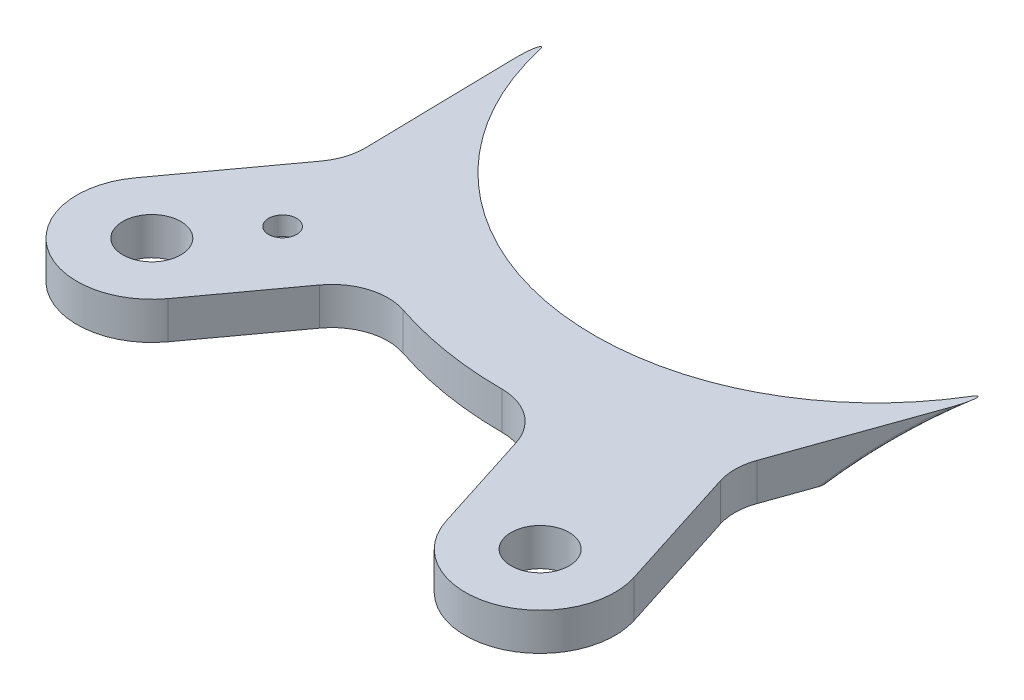
ISO-10303-21;
HEADER;
FILE_DESCRIPTION(('STEP AP214'),'2;1');
FILE_NAME('part.step','',(''),(''),'','','');
FILE_SCHEMA(('AUTOMOTIVE_DESIGN { 1 0 10303 214 1 1 1 1 }'));
ENDSEC;
DATA;
#1=APPLICATION_CONTEXT('core data for automotive mechanical design processes');
#2=APPLICATION_PROTOCOL_DEFINITION('international standard','automotive_design',2000,#1);
#3=PRODUCT_CONTEXT('',#1,'mechanical');
#4=PRODUCT('Part','Part','',(#3));
#5=PRODUCT_RELATED_PRODUCT_CATEGORY('part','',(#4));
#6=PRODUCT_DEFINITION_FORMATION('','',#4);
#7=PRODUCT_DEFINITION_CONTEXT('part definition',#1,'design');
#8=PRODUCT_DEFINITION('design','',#6,#7);
#9=PRODUCT_DEFINITION_SHAPE('','',#8);
#10=(LENGTH_UNIT() NAMED_UNIT(*) SI_UNIT(.MILLI.,.METRE.));
#11=(NAMED_UNIT(*) PLANE_ANGLE_UNIT() SI_UNIT($,.RADIAN.));
#12=(NAMED_UNIT(*) SI_UNIT($,.STERADIAN.) SOLID_ANGLE_UNIT());
#13=UNCERTAINTY_MEASURE_WITH_UNIT(LENGTH_MEASURE(1.E-05),#10,'distance_accuracy_value','');
#14=(GEOMETRIC_REPRESENTATION_CONTEXT(3) GLOBAL_UNCERTAINTY_ASSIGNED_CONTEXT((#13)) GLOBAL_UNIT_ASSIGNED_CONTEXT((#10,
#11,#12)) REPRESENTATION_CONTEXT('',''));
#15=CARTESIAN_POINT('',(0.,0.,0.));
#16=DIRECTION('',(0.,0.,1.));
#17=DIRECTION('',(1.,0.,0.));
#18=AXIS2_PLACEMENT_3D('',#15,#16,#17);
#19=CARTESIAN_POINT('',(-11.920981795953,2.,-8.70254765488495));
#20=DIRECTION('',(0.807679539292025,0.,0.589621710768033));
#21=DIRECTION('',(0.589621710768033,0.,-0.807679539292026));
#22=AXIS2_PLACEMENT_3D('',#19,#20,#21);
#23=PLANE('',#22);
#24=DIRECTION('',(-0.589621710768033,0.,0.807679539292026));
#25=VECTOR('',#24,1.);
#26=CARTESIAN_POINT('',(-11.920981795953,2.,-8.70254765488495));
#27=LINE('',#26,#25);
#28=CARTESIAN_POINT('',(-10.0241295132366,2.,-11.3009064836563));
#29=VERTEX_POINT('',#28);
#30=CARTESIAN_POINT('',(-14.2059725719786,2.,-5.57250636983299));
#31=VERTEX_POINT('',#30);
#32=EDGE_CURVE('E165',#29,#31,#27,.T.);
#33=ORIENTED_EDGE('',*,*,#32,.F.);
#34=DIRECTION('',(0.,-1.,0.));
#35=VECTOR('',#34,1.);
#36=CARTESIAN_POINT('',(-10.0241295132366,2.,-11.3009064836563));
#37=LINE('',#36,#35);
#38=CARTESIAN_POINT('',(-10.0241295132366,0.,-11.3009064836563));
#39=VERTEX_POINT('',#38);
#40=EDGE_CURVE('E197',#29,#39,#37,.T.);
#41=ORIENTED_EDGE('',*,*,#40,.T.);
#42=DIRECTION('',(-0.589621710768033,0.,0.807679539292026));
#43=VECTOR('',#42,1.);
#44=CARTESIAN_POINT('',(-11.920981795953,0.,-8.70254765488495));
#45=LINE('',#44,#43);
#46=CARTESIAN_POINT('',(-14.2059725719786,0.,-5.57250636983299));
#47=VERTEX_POINT('',#46);
#48=EDGE_CURVE('E194',#39,#47,#45,.T.);
#49=ORIENTED_EDGE('',*,*,#48,.T.);
#50=DIRECTION('',(0.,-1.,0.));
#51=VECTOR('',#50,1.);
#52=CARTESIAN_POINT('',(-14.2059725719786,2.,-5.57250636983299));
#53=LINE('',#52,#51);
#54=EDGE_CURVE('E186',#31,#47,#53,.T.);
#55=ORIENTED_EDGE('',*,*,#54,.F.);
#56=EDGE_LOOP('',(#33,#41,#49,#55));
#57=FACE_BOUND('',#56,.T.);
#58=ADVANCED_FACE('F47',(#57),#23,.F.);
#59=CARTESIAN_POINT('',(-10.9752544148105,2.,-3.21401952676085));
#60=DIRECTION('',(0.,-1.,0.));
#61=DIRECTION('',(0.,0.,-1.));
#62=AXIS2_PLACEMENT_3D('',#59,#60,#61);
#63=CYLINDRICAL_SURFACE('',#62,4.00000000000001);
#64=CARTESIAN_POINT('',(-10.9752544148105,0.,-3.21401952676085));
#65=DIRECTION('',(0.,1.,0.));
#66=DIRECTION('',(0.,0.,1.));
#67=AXIS2_PLACEMENT_3D('',#64,#65,#66);
#68=CIRCLE('',#67,4.00000000000001);
#69=CARTESIAN_POINT('',(-7.74453625764238,0.,-0.855532683688701));
#70=VERTEX_POINT('',#69);
#71=EDGE_CURVE('E440',#47,#70,#68,.T.);
#72=ORIENTED_EDGE('',*,*,#71,.T.);
#73=DIRECTION('',(0.,-1.,0.));
#74=VECTOR('',#73,1.);
#75=CARTESIAN_POINT('',(-7.74453625764238,2.,-0.855532683688701));
#76=LINE('',#75,#74);
#77=CARTESIAN_POINT('',(-7.74453625764238,2.,-0.855532683688701));
#78=VERTEX_POINT('',#77);
#79=EDGE_CURVE('E188',#78,#70,#76,.T.);
#80=ORIENTED_EDGE('',*,*,#79,.F.);
#81=CARTESIAN_POINT('',(-10.9752544148105,2.,-3.21401952676085));
#82=DIRECTION('',(0.,1.,0.));
#83=DIRECTION('',(0.,0.,1.));
#84=AXIS2_PLACEMENT_3D('',#81,#82,#83);
#85=CIRCLE('',#84,4.00000000000001);
#86=EDGE_CURVE('E171',#31,#78,#85,.T.);
#87=ORIENTED_EDGE('',*,*,#86,.F.);
#88=ORIENTED_EDGE('',*,*,#54,.T.);
#89=EDGE_LOOP('',(#72,#80,#87,#88));
#90=FACE_BOUND('',#89,.T.);
#91=ADVANCED_FACE('F185',(#90),#63,.T.);
#92=CARTESIAN_POINT('',(-5.45954548161673,2.,-3.98557396874065));
#93=DIRECTION('',(-0.807679539292025,0.,-0.589621710768033));
#94=DIRECTION('',(-0.589621710768033,0.,0.807679539292025));
#95=AXIS2_PLACEMENT_3D('',#92,#93,#94);
#96=PLANE('',#95);
#97=DIRECTION('',(0.589621710768033,0.,-0.807679539292025));
#98=VECTOR('',#97,1.);
#99=CARTESIAN_POINT('',(-5.45954548161673,0.,-3.98557396874065));
#100=LINE('',#99,#98);
#101=CARTESIAN_POINT('',(-4.32997932465112,0.,-5.53288380587244));
#102=VERTEX_POINT('',#101);
#103=EDGE_CURVE('E405',#70,#102,#100,.T.);
#104=ORIENTED_EDGE('',*,*,#103,.T.);
#105=DIRECTION('',(0.,1.,0.));
#106=VECTOR('',#105,1.);
#107=CARTESIAN_POINT('',(-4.32997932465112,2.,-5.53288380587244));
#108=LINE('',#107,#106);
#109=CARTESIAN_POINT('',(-4.32997932465112,2.,-5.53288380587244));
#110=VERTEX_POINT('',#109);
#111=EDGE_CURVE('E227',#102,#110,#108,.T.);
#112=ORIENTED_EDGE('',*,*,#111,.T.);
#113=DIRECTION('',(0.589621710768033,0.,-0.807679539292025));
#114=VECTOR('',#113,1.);
#115=CARTESIAN_POINT('',(-5.45954548161673,2.,-3.98557396874065));
#116=LINE('',#115,#114);
#117=EDGE_CURVE('E191',#78,#110,#116,.T.);
#118=ORIENTED_EDGE('',*,*,#117,.F.);
#119=ORIENTED_EDGE('',*,*,#79,.T.);
#120=EDGE_LOOP('',(#104,#112,#118,#119));
#121=FACE_BOUND('',#120,.T.);
#122=ADVANCED_FACE('F328',(#121),#96,.F.);
#123=CARTESIAN_POINT('',(5.35726697347827,2.,-25.5867427651695));
#124=DIRECTION('',(0.,-1.,0.));
#125=DIRECTION('',(0.,0.,-1.));
#126=AXIS2_PLACEMENT_3D('',#123,#124,#125);
#127=CYLINDRICAL_SURFACE('',#126,20.);
#128=CARTESIAN_POINT('',(5.35726697347827,0.,-25.5867427651695));
#129=DIRECTION('',(0.,1.,0.));
#130=DIRECTION('',(0.,0.,1.));
#131=AXIS2_PLACEMENT_3D('',#128,#129,#130);
#132=CIRCLE('',#131,20.);
#133=CARTESIAN_POINT('',(-0.959435357176782,0.,-6.61046094638588));
#134=VERTEX_POINT('',#133);
#135=CARTESIAN_POINT('',(5.35473098050555,0.,-5.58674292595099));
#136=VERTEX_POINT('',#135);
#137=EDGE_CURVE('E401',#134,#136,#132,.T.);
#138=ORIENTED_EDGE('',*,*,#137,.T.);
#139=DIRECTION('',(0.,-1.,0.));
#140=VECTOR('',#139,1.);
#141=CARTESIAN_POINT('',(5.35473098050555,2.,-5.58674292595099));
#142=LINE('',#141,#140);
#143=CARTESIAN_POINT('',(5.35473098050555,2.,-5.58674292595099));
#144=VERTEX_POINT('',#143);
#145=EDGE_CURVE('E224',#136,#144,#142,.F.);
#146=ORIENTED_EDGE('',*,*,#145,.T.);
#147=CARTESIAN_POINT('',(5.35726697347827,2.,-25.5867427651695));
#148=DIRECTION('',(0.,1.,0.));
#149=DIRECTION('',(0.,0.,1.));
#150=AXIS2_PLACEMENT_3D('',#147,#148,#149);
#151=CIRCLE('',#150,20.);
#152=CARTESIAN_POINT('',(-0.959435357176782,2.,-6.61046094638588));
#153=VERTEX_POINT('',#152);
#154=EDGE_CURVE('E451',#153,#144,#151,.T.);
#155=ORIENTED_EDGE('',*,*,#154,.F.);
#156=DIRECTION('',(0.,-1.,0.));
#157=VECTOR('',#156,1.);
#158=CARTESIAN_POINT('',(-0.959435357176783,2.,-6.61046094638587));
#159=LINE('',#158,#157);
#160=EDGE_CURVE('E220',#153,#134,#159,.T.);
#161=ORIENTED_EDGE('',*,*,#160,.T.);
#162=EDGE_LOOP('',(#138,#146,#155,#161));
#163=FACE_BOUND('',#162,.T.);
#164=ADVANCED_FACE('F331',(#163),#127,.T.);
#165=CARTESIAN_POINT('',(8.46623721619208,2.,-2.70382058589086));
#166=DIRECTION('',(-0.952599553113903,0.,0.304227039244038));
#167=DIRECTION('',(0.304227039244038,0.,0.952599553113903));
#168=AXIS2_PLACEMENT_3D('',#165,#166,#167);
#169=PLANE('',#168);
#170=DIRECTION('',(-0.304227039244038,0.,-0.952599553113902));
#171=VECTOR('',#170,1.);
#172=CARTESIAN_POINT('',(8.46623721619208,2.,-2.70382058589086));
#173=LINE('',#172,#171);
#174=CARTESIAN_POINT('',(9.97395774809266,2.,2.01717301309372));
#175=VERTEX_POINT('',#174);
#176=CARTESIAN_POINT('',(8.21214924090135,2.,-3.49942406780033));
#177=VERTEX_POINT('',#176);
#178=EDGE_CURVE('E456',#175,#177,#173,.T.);
#179=ORIENTED_EDGE('',*,*,#178,.T.);
#180=DIRECTION('',(0.,-1.,0.));
#181=VECTOR('',#180,1.);
#182=CARTESIAN_POINT('',(8.21214924090135,2.,-3.49942406780033));
#183=LINE('',#182,#181);
#184=CARTESIAN_POINT('',(8.21214924090135,0.,-3.49942406780033));
#185=VERTEX_POINT('',#184);
#186=EDGE_CURVE('E216',#177,#185,#183,.T.);
#187=ORIENTED_EDGE('',*,*,#186,.T.);
#188=DIRECTION('',(-0.304227039244038,0.,-0.952599553113902));
#189=VECTOR('',#188,1.);
#190=CARTESIAN_POINT('',(8.46623721619208,0.,-2.70382058589086));
#191=LINE('',#190,#189);
#192=CARTESIAN_POINT('',(9.97395774809266,0.,2.01717301309372));
#193=VERTEX_POINT('',#192);
#194=EDGE_CURVE('E394',#193,#185,#191,.T.);
#195=ORIENTED_EDGE('',*,*,#194,.F.);
#196=DIRECTION('',(0.,-1.,0.));
#197=VECTOR('',#196,1.);
#198=CARTESIAN_POINT('',(9.97395774809266,2.,2.01717301309372));
#199=LINE('',#198,#197);
#200=EDGE_CURVE('E203',#175,#193,#199,.T.);
#201=ORIENTED_EDGE('',*,*,#200,.F.);
#202=EDGE_LOOP('',(#179,#187,#195,#201));
#203=FACE_BOUND('',#202,.T.);
#204=ADVANCED_FACE('F335',(#203),#169,.T.);
#205=CARTESIAN_POINT('',(13.7843559605483,2.,0.800264856117561));
#206=DIRECTION('',(0.,-1.,0.));
#207=DIRECTION('',(0.,0.,-1.));
#208=AXIS2_PLACEMENT_3D('',#205,#206,#207);
#209=CYLINDRICAL_SURFACE('',#208,4.00000000000002);
#210=CARTESIAN_POINT('',(13.7843559605483,0.,0.800264856117561));
#211=DIRECTION('',(0.,1.,0.));
#212=DIRECTION('',(0.,0.,1.));
#213=AXIS2_PLACEMENT_3D('',#210,#211,#212);
#214=CIRCLE('',#213,4.00000000000002);
#215=CARTESIAN_POINT('',(17.5947541730039,0.,-0.416643300858593));
#216=VERTEX_POINT('',#215);
#217=EDGE_CURVE('E387',#193,#216,#214,.T.);
#218=ORIENTED_EDGE('',*,*,#217,.T.);
#219=DIRECTION('',(0.,-1.,0.));
#220=VECTOR('',#219,1.);
#221=CARTESIAN_POINT('',(17.5947541730039,2.,-0.416643300858593));
#222=LINE('',#221,#220);
#223=CARTESIAN_POINT('',(17.5947541730039,2.,-0.416643300858593));
#224=VERTEX_POINT('',#223);
#225=EDGE_CURVE('E379',#224,#216,#222,.T.);
#226=ORIENTED_EDGE('',*,*,#225,.F.);
#227=CARTESIAN_POINT('',(13.7843559605483,2.,0.800264856117561));
#228=DIRECTION('',(0.,1.,0.));
#229=DIRECTION('',(0.,0.,1.));
#230=AXIS2_PLACEMENT_3D('',#227,#228,#229);
#231=CIRCLE('',#230,4.00000000000002);
#232=EDGE_CURVE('E388',#175,#224,#231,.T.);
#233=ORIENTED_EDGE('',*,*,#232,.F.);
#234=ORIENTED_EDGE('',*,*,#200,.T.);
#235=EDGE_LOOP('',(#218,#226,#233,#234));
#236=FACE_BOUND('',#235,.T.);
#237=ADVANCED_FACE('F339',(#236),#209,.T.);
#238=CARTESIAN_POINT('',(16.0870336411034,2.,-5.13763689984319));
#239=DIRECTION('',(-0.952599553113902,0.,0.304227039244038));
#240=DIRECTION('',(0.304227039244038,0.,0.952599553113902));
#241=AXIS2_PLACEMENT_3D('',#238,#239,#240);
#242=PLANE('',#241);
#243=DIRECTION('',(-0.304227039244038,0.,-0.952599553113903));
#244=VECTOR('',#243,1.);
#245=CARTESIAN_POINT('',(16.0870336411034,0.,-5.13763689984319));
#246=LINE('',#245,#244);
#247=CARTESIAN_POINT('',(15.437049140927,0.,-7.17287658773398));
#248=VERTEX_POINT('',#247);
#249=EDGE_CURVE('E396',#216,#248,#246,.T.);
#250=ORIENTED_EDGE('',*,*,#249,.T.);
#251=DIRECTION('',(0.,-1.,0.));
#252=VECTOR('',#251,1.);
#253=CARTESIAN_POINT('',(15.437049140927,2.,-7.17287658773397));
#254=LINE('',#253,#252);
#255=CARTESIAN_POINT('',(15.437049140927,2.,-7.17287658773398));
#256=VERTEX_POINT('',#255);
#257=EDGE_CURVE('E213',#248,#256,#254,.F.);
#258=ORIENTED_EDGE('',*,*,#257,.T.);
#259=DIRECTION('',(-0.304227039244038,0.,-0.952599553113903));
#260=VECTOR('',#259,1.);
#261=CARTESIAN_POINT('',(16.0870336411034,2.,-5.13763689984319));
#262=LINE('',#261,#260);
#263=EDGE_CURVE('E429',#224,#256,#262,.T.);
#264=ORIENTED_EDGE('',*,*,#263,.F.);
#265=ORIENTED_EDGE('',*,*,#225,.T.);
#266=EDGE_LOOP('',(#250,#258,#264,#265));
#267=FACE_BOUND('',#266,.T.);
#268=ADVANCED_FACE('F343',(#267),#242,.F.);
#269=CARTESIAN_POINT('',(10.8669421285882,2.,3.86073627490867));
#270=DIRECTION('',(-0.942298562553958,0.,-0.334773683267881));
#271=DIRECTION('',(-0.334773683267881,0.,0.942298562553959));
#272=AXIS2_PLACEMENT_3D('',#269,#270,#271);
#273=PLANE('',#272);
#274=DIRECTION('',(0.334773683267881,0.,-0.942298562553959));
#275=VECTOR('',#274,1.);
#276=CARTESIAN_POINT('',(10.8669421285882,0.,3.86073627490867));
#277=LINE('',#276,#275);
#278=CARTESIAN_POINT('',(15.4679521126068,0.,-9.08987875526974));
#279=VERTEX_POINT('',#278);
#280=CARTESIAN_POINT('',(16.3272653575067,0.,-11.5086161767677));
#281=VERTEX_POINT('',#280);
#282=EDGE_CURVE('E375',#279,#281,#277,.T.);
#283=ORIENTED_EDGE('',*,*,#282,.T.);
#284=CARTESIAN_POINT('',(19.5388603399153,-18.,-20.5483988319879));
#285=DIRECTION('',(-0.942298562553958,0.,-0.334773683267881));
#286=DIRECTION('',(-0.334773683267881,0.,0.942298562553959));
#287=AXIS2_PLACEMENT_3D('',#284,#285,#286);
#288=CIRCLE('',#287,20.3968628172239);
#289=CARTESIAN_POINT('',(18.1984266465281,2.,-16.7754357658708));
#290=VERTEX_POINT('',#289);
#291=EDGE_CURVE('E11',#281,#290,#288,.T.);
#292=ORIENTED_EDGE('',*,*,#291,.T.);
#293=DIRECTION('',(0.334773683267881,0.,-0.942298562553959));
#294=VECTOR('',#293,1.);
#295=CARTESIAN_POINT('',(10.8669421285882,2.,3.86073627490867));
#296=LINE('',#295,#294);
#297=CARTESIAN_POINT('',(15.4679521126068,2.,-9.08987875526974));
#298=VERTEX_POINT('',#297);
#299=EDGE_CURVE('E419',#298,#290,#296,.T.);
#300=ORIENTED_EDGE('',*,*,#299,.F.);
#301=DIRECTION('',(0.,-1.,0.));
#302=VECTOR('',#301,1.);
#303=CARTESIAN_POINT('',(15.4679521126068,0.,-9.08987875526973));
#304=LINE('',#303,#302);
#305=EDGE_CURVE('E209',#298,#279,#304,.T.);
#306=ORIENTED_EDGE('',*,*,#305,.T.);
#307=EDGE_LOOP('',(#283,#292,#300,#306));
#308=FACE_BOUND('',#307,.T.);
#309=ADVANCED_FACE('F347',(#308),#273,.F.);
#310=CARTESIAN_POINT('',(13.7843559605483,2.,0.800264856117561));
#311=DIRECTION('',(0.,-1.,0.));
#312=DIRECTION('',(0.,0.,-1.));
#313=AXIS2_PLACEMENT_3D('',#310,#311,#312);
#314=CYLINDRICAL_SURFACE('',#313,1.55);
#315=CARTESIAN_POINT('',(13.7843559605483,2.,0.800264856117561));
#316=DIRECTION('',(0.,1.,0.));
#317=DIRECTION('',(0.,0.,1.));
#318=AXIS2_PLACEMENT_3D('',#315,#316,#317);
#319=CIRCLE('',#318,1.55);
#320=CARTESIAN_POINT('',(13.7843559605483,2.,2.35026485611756));
#321=VERTEX_POINT('',#320);
#322=EDGE_CURVE('E363',#321,#321,#319,.T.);
#323=ORIENTED_EDGE('',*,*,#322,.T.);
#324=EDGE_LOOP('',(#323));
#325=FACE_BOUND('',#324,.T.);
#326=CARTESIAN_POINT('',(13.7843559605483,0.,0.800264856117561));
#327=DIRECTION('',(0.,1.,0.));
#328=DIRECTION('',(0.,0.,1.));
#329=AXIS2_PLACEMENT_3D('',#326,#327,#328);
#330=CIRCLE('',#329,1.55);
#331=CARTESIAN_POINT('',(13.7843559605483,0.,2.35026485611756));
#332=VERTEX_POINT('',#331);
#333=EDGE_CURVE('E366',#332,#332,#330,.T.);
#334=ORIENTED_EDGE('',*,*,#333,.F.);
#335=EDGE_LOOP('',(#334));
#336=FACE_BOUND('',#335,.T.);
#337=ADVANCED_FACE('F351',(#325,#336),#314,.F.);
#338=CARTESIAN_POINT('',(-9.18279284805776,2.,0.182775951464731));
#339=DIRECTION('',(-0.999801970670517,0.,0.0199002372686941));
#340=DIRECTION('',(0.0199002372686941,0.,0.999801970670517));
#341=AXIS2_PLACEMENT_3D('',#338,#339,#340);
#342=PLANE('',#341);
#343=DIRECTION('',(-0.0199002372686941,0.,-0.999801970670517));
#344=VECTOR('',#343,1.);
#345=CARTESIAN_POINT('',(-9.18279284805776,2.,0.182775951464731));
#346=LINE('',#345,#344);
#347=CARTESIAN_POINT('',(-9.44776221910111,2.,-13.1294723277665));
#348=VERTEX_POINT('',#347);
#349=CARTESIAN_POINT('',(-9.61007214307945,2.,-21.2840375051486));
#350=VERTEX_POINT('',#349);
#351=EDGE_CURVE('E424',#348,#350,#346,.T.);
#352=ORIENTED_EDGE('',*,*,#351,.T.);
#353=CARTESIAN_POINT('',(-9.68975268511302,-18.,-25.2872441942756));
#354=DIRECTION('',(-0.999801970670517,0.,0.0199002372686941));
#355=DIRECTION('',(0.0199002372686941,0.,0.999801970670517));
#356=AXIS2_PLACEMENT_3D('',#353,#354,#355);
#357=CIRCLE('',#356,20.3968628172239);
#358=CARTESIAN_POINT('',(-9.49884310841927,0.,-15.6958122720767));
#359=VERTEX_POINT('',#358);
#360=EDGE_CURVE('E72',#350,#359,#357,.F.);
#361=ORIENTED_EDGE('',*,*,#360,.T.);
#362=DIRECTION('',(-0.0199002372686941,0.,-0.999801970670517));
#363=VECTOR('',#362,1.);
#364=CARTESIAN_POINT('',(-9.18279284805776,0.,0.182775951464731));
#365=LINE('',#364,#363);
#366=CARTESIAN_POINT('',(-9.44776221910111,0.,-13.1294723277665));
#367=VERTEX_POINT('',#366);
#368=EDGE_CURVE('E369',#367,#359,#365,.T.);
#369=ORIENTED_EDGE('',*,*,#368,.F.);
#370=DIRECTION('',(0.,-1.,0.));
#371=VECTOR('',#370,1.);
#372=CARTESIAN_POINT('',(-9.44776221910111,2.,-13.1294723277665));
#373=LINE('',#372,#371);
#374=EDGE_CURVE('E201',#367,#348,#373,.F.);
#375=ORIENTED_EDGE('',*,*,#374,.T.);
#376=EDGE_LOOP('',(#352,#361,#369,#375));
#377=FACE_BOUND('',#376,.T.);
#378=ADVANCED_FACE('F353',(#377),#342,.T.);
#379=CARTESIAN_POINT('',(-10.9752544148105,2.,-3.21401952676085));
#380=DIRECTION('',(0.,-1.,0.));
#381=DIRECTION('',(0.,0.,-1.));
#382=AXIS2_PLACEMENT_3D('',#379,#380,#381);
#383=CYLINDRICAL_SURFACE('',#382,1.55);
#384=CARTESIAN_POINT('',(-10.9752544148105,2.,-3.21401952676085));
#385=DIRECTION('',(0.,1.,0.));
#386=DIRECTION('',(0.,0.,1.));
#387=AXIS2_PLACEMENT_3D('',#384,#385,#386);
#388=CIRCLE('',#387,1.55);
#389=CARTESIAN_POINT('',(-10.9752544148105,2.,-1.66401952676085));
#390=VERTEX_POINT('',#389);
#391=EDGE_CURVE('E382',#390,#390,#388,.T.);
#392=ORIENTED_EDGE('',*,*,#391,.T.);
#393=EDGE_LOOP('',(#392));
#394=FACE_BOUND('',#393,.T.);
#395=CARTESIAN_POINT('',(-10.9752544148105,0.,-3.21401952676085));
#396=DIRECTION('',(0.,1.,0.));
#397=DIRECTION('',(0.,0.,1.));
#398=AXIS2_PLACEMENT_3D('',#395,#396,#397);
#399=CIRCLE('',#398,1.55);
#400=CARTESIAN_POINT('',(-10.9752544148105,0.,-1.66401952676085));
#401=VERTEX_POINT('',#400);
#402=EDGE_CURVE('E181',#401,#401,#399,.T.);
#403=ORIENTED_EDGE('',*,*,#402,.F.);
#404=EDGE_LOOP('',(#403));
#405=FACE_BOUND('',#404,.T.);
#406=ADVANCED_FACE('F282',(#394,#405),#383,.F.);
#407=CARTESIAN_POINT('',(0.,2.,0.));
#408=DIRECTION('',(0.,1.,0.));
#409=DIRECTION('',(0.,0.,1.));
#410=AXIS2_PLACEMENT_3D('',#407,#408,#409);
#411=PLANE('',#410);
#412=CARTESIAN_POINT('',(-8.02714586097033,2.,-7.25241722322096));
#413=DIRECTION('',(0.,1.,0.));
#414=DIRECTION('',(0.,0.,1.));
#415=AXIS2_PLACEMENT_3D('',#412,#413,#414);
#416=CIRCLE('',#415,0.75);
#417=CARTESIAN_POINT('',(-8.02714586097033,2.,-6.50241722322096));
#418=VERTEX_POINT('',#417);
#419=EDGE_CURVE('E470',#418,#418,#416,.T.);
#420=ORIENTED_EDGE('',*,*,#419,.F.);
#421=EDGE_LOOP('',(#420));
#422=FACE_BOUND('',#421,.T.);
#423=CARTESIAN_POINT('',(5.35726697347827,2.,-25.5867427651695));
#424=DIRECTION('',(0.,1.,0.));
#425=DIRECTION('',(0.,0.,1.));
#426=AXIS2_PLACEMENT_3D('',#423,#424,#425);
#427=CIRCLE('',#426,15.05);
#428=CARTESIAN_POINT('',(-9.31088381532145,2.,-22.2180854010207));
#429=VERTEX_POINT('',#428);
#430=CARTESIAN_POINT('',(18.2096820277284,2.,-17.7561663321548));
#431=VERTEX_POINT('',#430);
#432=EDGE_CURVE('E418',#429,#431,#427,.T.);
#433=ORIENTED_EDGE('',*,*,#432,.F.);
#434=CARTESIAN_POINT('',(-9.31088381532146,2.00000000000001,-22.2180854010207));
#435=CARTESIAN_POINT('',(-9.31555641655311,2.,-22.2382909203552));
#436=CARTESIAN_POINT('',(-9.32046537573929,2.,-22.2584442576725));
#437=CARTESIAN_POINT('',(-9.33134142379288,2.,-22.2993854488622));
#438=CARTESIAN_POINT('',(-9.33734481329447,2.,-22.3201635336129));
#439=CARTESIAN_POINT('',(-9.35065952780433,2.,-22.3613408301784));
#440=CARTESIAN_POINT('',(-9.35797079605261,2.,-22.3817400583925));
#441=CARTESIAN_POINT('',(-9.37086209396228,2.,-22.4113042273499));
#442=CARTESIAN_POINT('',(-9.37543365134419,2.,-22.4209099361887));
#443=CARTESIAN_POINT('',(-9.38562148590211,2.,-22.4395390539921));
#444=CARTESIAN_POINT('',(-9.3912299245235,2.,-22.4485661893129));
#445=CARTESIAN_POINT('',(-9.40016965957643,2.,-22.459559214407));
#446=CARTESIAN_POINT('',(-9.40257044719616,2.,-22.4622623971568));
#447=CARTESIAN_POINT('',(-9.40770930592219,2.,-22.4673239388487));
#448=CARTESIAN_POINT('',(-9.4104459646682,2.,-22.4696836563079));
#449=CARTESIAN_POINT('',(-9.41499007060114,2.,-22.4728613648566));
#450=CARTESIAN_POINT('',(-9.4166483797332,2.,-22.4738902215766));
#451=CARTESIAN_POINT('',(-9.42009565207023,2.,-22.4757049806616));
#452=CARTESIAN_POINT('',(-9.42188452629736,2.,-22.4764910466079));
#453=CARTESIAN_POINT('',(-9.4252947249552,2.,-22.4776455950044));
#454=CARTESIAN_POINT('',(-9.4269004601863,2.,-22.4780592582312));
#455=CARTESIAN_POINT('',(-9.43015821106906,2.,-22.4786088115326));
#456=CARTESIAN_POINT('',(-9.43181016001429,2.,-22.4787450829541));
#457=CARTESIAN_POINT('',(-9.43511575166808,2.,-22.4787208828975));
#458=CARTESIAN_POINT('',(-9.43676938985418,2.,-22.4785597445922));
#459=CARTESIAN_POINT('',(-9.4400248215269,2.,-22.4779564448526));
#460=CARTESIAN_POINT('',(-9.4416265533279,2.,-22.4775139610738));
#461=CARTESIAN_POINT('',(-9.44523099034735,2.,-22.4762158064806));
#462=CARTESIAN_POINT('',(-9.44720231740617,2.,-22.4752741662457));
#463=CARTESIAN_POINT('',(-9.45097210759778,2.,-22.4730936977507));
#464=CARTESIAN_POINT('',(-9.45277014283213,2.,-22.4718541589826));
#465=CARTESIAN_POINT('',(-9.45757262191559,2.,-22.4681030415829));
#466=CARTESIAN_POINT('',(-9.46039724222156,2.,-22.4653646755201));
#467=CARTESIAN_POINT('',(-9.46564847587058,2.,-22.459533634614));
#468=CARTESIAN_POINT('',(-9.46807378695455,2.,-22.4564398542559));
#469=CARTESIAN_POINT('',(-9.47792283046101,2.,-22.4427037563147));
#470=CARTESIAN_POINT('',(-9.48397259395117,2.,-22.4311098102737));
#471=CARTESIAN_POINT('',(-9.49476865998066,2.,-22.4073370392873));
#472=CARTESIAN_POINT('',(-9.49950503048833,2.,-22.3951545344472));
#473=CARTESIAN_POINT('',(-9.50890211613432,2.,-22.3683902512919));
#474=CARTESIAN_POINT('',(-9.51341221865179,2.,-22.3537535722017));
#475=CARTESIAN_POINT('',(-9.52173390924428,2.,-22.3242807016266));
#476=CARTESIAN_POINT('',(-9.52554481172664,2.,-22.3094443294698));
#477=CARTESIAN_POINT('',(-9.53624994143273,2.,-22.2646977202893));
#478=CARTESIAN_POINT('',(-9.54239832125074,2.,-22.2346087998787));
#479=CARTESIAN_POINT('',(-9.55348723897454,2.,-22.1742068996893));
#480=CARTESIAN_POINT('',(-9.5584271638757,2.,-22.1438938141984));
#481=CARTESIAN_POINT('',(-9.56740560686485,2.,-22.0831755138019));
#482=CARTESIAN_POINT('',(-9.57144529198669,2.,-22.0527704705777));
#483=CARTESIAN_POINT('',(-9.58261335797579,2.,-21.9605935106888));
#484=CARTESIAN_POINT('',(-9.58865087719758,2.,-21.8986899014918));
#485=CARTESIAN_POINT('',(-9.59852368823235,2.,-21.7746658713966));
#486=CARTESIAN_POINT('',(-9.6023572065246,2.,-21.712545316249));
#487=CARTESIAN_POINT('',(-9.60796833886522,2.,-21.5893331510978));
#488=CARTESIAN_POINT('',(-9.6097817778643,2.,-21.5282431854409));
#489=CARTESIAN_POINT('',(-9.61142414664332,2.,-21.4061086649073));
#490=CARTESIAN_POINT('',(-9.61125540618424,2.,-21.3450641410383));
#491=CARTESIAN_POINT('',(-9.61007214307948,2.,-21.2840375051486));
#492=B_SPLINE_CURVE_WITH_KNOTS('',3,(#434,#435,#436,#437,#438,#439,#440,#441,#442,#443,#444,
#445,#446,#447,#448,#449,#450,#451,#452,#453,#454,#455,#456,#457,#458,#459,#460,#461,#462,#463,
#464,#465,#466,#467,#468,#469,#470,#471,#472,#473,#474,#475,#476,#477,#478,#479,#480,#481,#482,
#483,#484,#485,#486,#487,#488,#489,#490,#491),.UNSPECIFIED.,.F.,.F.,(4,2,2,2,2,2,2,2,2,2,2,2,2,
2,2,2,2,2,2,2,2,2,2,2,2,2,2,2,4),(0.,0.062212505775733,0.127088205333148,0.191961090064741,
0.223865271374464,0.25553745698359,0.266365519943473,0.277149517309251,0.28298990502935,
0.288826349135677,0.293779909018201,0.298726654335379,0.303684504306633,0.308648044869915,
0.315164866520276,0.321697388233565,0.333433191258733,0.345206540749752,0.384135715903304,
0.423351712981499,0.469254638399312,0.515202335631222,0.607282071665096,0.699408419948521,
0.791414635548244,0.977949713213466,1.16463468303931,1.34795341126371,1.53105669681335),.UNSPECIFIED.);
#493=EDGE_CURVE('E271',#429,#350,#492,.T.);
#494=ORIENTED_EDGE('',*,*,#493,.T.);
#495=ORIENTED_EDGE('',*,*,#351,.F.);
#496=CARTESIAN_POINT('',(-12.4471681311127,2.,-13.0697716159604));
#497=DIRECTION('',(0.,1.,0.));
#498=DIRECTION('',(0.,0.,1.));
#499=AXIS2_PLACEMENT_3D('',#496,#497,#498);
#500=CIRCLE('',#499,3.);
#501=EDGE_CURVE('E175',#348,#29,#500,.F.);
#502=ORIENTED_EDGE('',*,*,#501,.T.);
#503=ORIENTED_EDGE('',*,*,#32,.T.);
#504=ORIENTED_EDGE('',*,*,#86,.T.);
#505=ORIENTED_EDGE('',*,*,#117,.T.);
#506=CARTESIAN_POINT('',(-1.90694070677504,2.,-3.76401867356834));
#507=DIRECTION('',(0.,1.,0.));
#508=DIRECTION('',(0.,0.,1.));
#509=AXIS2_PLACEMENT_3D('',#506,#507,#508);
#510=CIRCLE('',#509,3.);
#511=EDGE_CURVE('E250',#110,#153,#510,.F.);
#512=ORIENTED_EDGE('',*,*,#511,.T.);
#513=ORIENTED_EDGE('',*,*,#154,.T.);
#514=CARTESIAN_POINT('',(5.35435058155964,2.,-2.58674295006821));
#515=DIRECTION('',(0.,1.,0.));
#516=DIRECTION('',(0.,0.,1.));
#517=AXIS2_PLACEMENT_3D('',#514,#515,#516);
#518=CIRCLE('',#517,3.);
#519=EDGE_CURVE('E244',#144,#177,#518,.F.);
#520=ORIENTED_EDGE('',*,*,#519,.T.);
#521=ORIENTED_EDGE('',*,*,#178,.F.);
#522=ORIENTED_EDGE('',*,*,#232,.T.);
#523=ORIENTED_EDGE('',*,*,#263,.T.);
#524=CARTESIAN_POINT('',(18.2948478002687,2.,-8.08555770546609));
#525=DIRECTION('',(0.,1.,0.));
#526=DIRECTION('',(0.,0.,1.));
#527=AXIS2_PLACEMENT_3D('',#524,#525,#526);
#528=CIRCLE('',#527,3.);
#529=EDGE_CURVE('E238',#256,#298,#528,.F.);
#530=ORIENTED_EDGE('',*,*,#529,.T.);
#531=ORIENTED_EDGE('',*,*,#299,.T.);
#532=CARTESIAN_POINT('',(18.1984266465281,2.,-16.7754357658708));
#533=CARTESIAN_POINT('',(18.2095612771583,2.,-16.8067825725951));
#534=CARTESIAN_POINT('',(18.2203980922093,2.,-16.8382335910822));
#535=CARTESIAN_POINT('',(18.2414996904124,2.,-16.9013285396796));
#536=CARTESIAN_POINT('',(18.2517644488681,2.,-16.9329724780533));
#537=CARTESIAN_POINT('',(18.28184968234,2.,-17.0285317379544));
#538=CARTESIAN_POINT('',(18.3008333838465,2.,-17.0927131329862));
#539=CARTESIAN_POINT('',(18.3309247073037,2.,-17.2014335841306));
#540=CARTESIAN_POINT('',(18.342632828334,2.,-17.2458078491408));
#541=CARTESIAN_POINT('',(18.3648876387144,2.,-17.334861455449));
#542=CARTESIAN_POINT('',(18.3754340300293,2.,-17.3795408719241));
#543=CARTESIAN_POINT('',(18.3950971359431,2.,-17.4690145348579));
#544=CARTESIAN_POINT('',(18.4042197382373,2.,-17.5138074855055));
#545=CARTESIAN_POINT('',(18.420650875193,2.,-17.6037151939747));
#546=CARTESIAN_POINT('',(18.4279604585865,2.,-17.6488297501542));
#547=CARTESIAN_POINT('',(18.4361892537234,2.,-17.7132225607664));
#548=CARTESIAN_POINT('',(18.4383580957004,2.,-17.7323367665635));
#549=CARTESIAN_POINT('',(18.4419335470686,2.,-17.7707372950418));
#550=CARTESIAN_POINT('',(18.4433360659779,2.,-17.79002399342));
#551=CARTESIAN_POINT('',(18.444987038549,2.,-17.8288541046273));
#552=CARTESIAN_POINT('',(18.4452247193032,2.,-17.8483982437231));
#553=CARTESIAN_POINT('',(18.4438218797791,2.,-17.877584660525));
#554=CARTESIAN_POINT('',(18.4430650742524,2.,-17.8872679947931));
#555=CARTESIAN_POINT('',(18.4406141520807,2.,-17.9065083296798));
#556=CARTESIAN_POINT('',(18.4389242081131,2.,-17.9160657001596));
#557=CARTESIAN_POINT('',(18.4351365358981,2.,-17.9296250505239));
#558=CARTESIAN_POINT('',(18.433760032987,2.,-17.9338223543614));
#559=CARTESIAN_POINT('',(18.4304362478791,2.,-17.9419782119565));
#560=CARTESIAN_POINT('',(18.4284926522851,2.,-17.9459381146271));
#561=CARTESIAN_POINT('',(18.4250762056109,2.,-17.9512469551083));
#562=CARTESIAN_POINT('',(18.423949643632,2.,-17.9528157859199));
#563=CARTESIAN_POINT('',(18.4214982409242,2.,-17.9557949664686));
#564=CARTESIAN_POINT('',(18.420173316131,2.,-17.9572052485682));
#565=CARTESIAN_POINT('',(18.4172880737322,2.,-17.9598101662714));
#566=CARTESIAN_POINT('',(18.4157247733439,2.,-17.961001574419));
#567=CARTESIAN_POINT('',(18.4123943776931,2.,-17.9630508663133));
#568=CARTESIAN_POINT('',(18.4106278034353,2.,-17.9639095791286));
#569=CARTESIAN_POINT('',(18.4071886232928,2.,-17.9651506249867));
#570=CARTESIAN_POINT('',(18.4055327393188,2.,-17.9655797261701));
#571=CARTESIAN_POINT('',(18.4021707789539,2.,-17.9661413712698));
#572=CARTESIAN_POINT('',(18.4004646365472,2.,-17.9662735057479));
#573=CARTESIAN_POINT('',(18.3965398629551,2.,-17.9662740612902));
#574=CARTESIAN_POINT('',(18.394321701914,2.,-17.9660510324273));
#575=CARTESIAN_POINT('',(18.3899489438197,2.,-17.9652620704521));
#576=CARTESIAN_POINT('',(18.3877944881729,2.,-17.9646954269589));
#577=CARTESIAN_POINT('',(18.3818265204624,2.,-17.9627445545244));
#578=CARTESIAN_POINT('',(18.3781098416193,2.,-17.9610714385279));
#579=CARTESIAN_POINT('',(18.3709350738807,2.,-17.9572430533389));
#580=CARTESIAN_POINT('',(18.3674780032267,2.,-17.9550860057266));
#581=CARTESIAN_POINT('',(18.3528150776698,2.,-17.945056132808));
#582=CARTESIAN_POINT('',(18.3426336900436,2.,-17.9357377363053));
#583=CARTESIAN_POINT('',(18.323303523094,2.,-17.916042335595));
#584=CARTESIAN_POINT('',(18.314166358955,2.,-17.9056554867592));
#585=CARTESIAN_POINT('',(18.2962508238354,2.,-17.8838929899084));
#586=CARTESIAN_POINT('',(18.2874990763231,2.,-17.8724948053551));
#587=CARTESIAN_POINT('',(18.2704939102549,2.,-17.849324363308));
#588=CARTESIAN_POINT('',(18.2622410733106,2.,-17.8375516927453));
#589=CARTESIAN_POINT('',(18.2464525809649,2.,-17.8142553456498));
#590=CARTESIAN_POINT('',(18.2389013548734,2.,-17.8027422265284));
#591=CARTESIAN_POINT('',(18.2240925763267,2.,-17.7795616766383));
#592=CARTESIAN_POINT('',(18.2168344501906,2.,-17.7678946131907));
#593=CARTESIAN_POINT('',(18.2096820277282,2.,-17.756166332155));
#594=B_SPLINE_CURVE_WITH_KNOTS('',3,(#532,#533,#534,#535,#536,#537,#538,#539,#540,#541,#542,
#543,#544,#545,#546,#547,#548,#549,#550,#551,#552,#553,#554,#555,#556,#557,#558,#559,#560,#561,
#562,#563,#564,#565,#566,#567,#568,#569,#570,#571,#572,#573,#574,#575,#576,#577,#578,#579,#580,
#581,#582,#583,#584,#585,#586,#587,#588,#589,#590,#591,#592,#593),.UNSPECIFIED.,.F.,.F.,(4,2,2,
2,2,2,2,2,2,2,2,2,2,2,2,2,2,2,2,2,2,2,2,2,2,2,2,2,2,2,4),(0.,0.0997927289627888,
0.199589762750852,0.400333057670879,0.537999690849962,0.675701559775934,0.812817983715192,
0.94985490737206,1.00755254651343,1.06555522823318,1.12409334356415,1.15321839095876,
1.18221424357119,1.19544570698313,1.20859300102831,1.21437477152071,1.22015899925137,
1.22602266201142,1.23187161720985,1.2369750766758,1.24208556815282,1.24873581624162,
1.2553998599916,1.26755885031257,1.27976327822479,1.32085126359138,1.36235911842833,
1.40543618931287,1.44856254614258,1.48986320755381,1.53107867041861),.UNSPECIFIED.);
#595=EDGE_CURVE('E263',#290,#431,#594,.T.);
#596=ORIENTED_EDGE('',*,*,#595,.T.);
#597=EDGE_LOOP('',(#433,#494,#495,#502,#503,#504,#505,#512,#513,#520,#521,#522,#523,#530,#531,#596));
#598=FACE_BOUND('',#597,.T.);
#599=ORIENTED_EDGE('',*,*,#322,.F.);
#600=EDGE_LOOP('',(#599));
#601=FACE_BOUND('',#600,.T.);
#602=ORIENTED_EDGE('',*,*,#391,.F.);
#603=EDGE_LOOP('',(#602));
#604=FACE_BOUND('',#603,.T.);
#605=ADVANCED_FACE('F168',(#422,#598,#601,#604),#411,.T.);
#606=CARTESIAN_POINT('',(0.,0.,0.));
#607=DIRECTION('',(0.,1.,0.));
#608=DIRECTION('',(0.,0.,1.));
#609=AXIS2_PLACEMENT_3D('',#606,#607,#608);
#610=PLANE('',#609);
#611=ORIENTED_EDGE('',*,*,#368,.T.);
#612=CARTESIAN_POINT('',(-9.49884310841927,0.,-15.6958122720767));
#613=CARTESIAN_POINT('',(-9.49927788322752,0.,-15.7185685262979));
#614=CARTESIAN_POINT('',(-9.49888853456147,0.,-15.741349008514));
#615=CARTESIAN_POINT('',(-9.49635287759061,0.,-15.786948042662));
#616=CARTESIAN_POINT('',(-9.49419601901949,0.,-15.8097659998863));
#617=CARTESIAN_POINT('',(-9.48776833172915,0.,-15.8569170609292));
#618=CARTESIAN_POINT('',(-9.48334615788865,0.,-15.8812300059381));
#619=CARTESIAN_POINT('',(-9.47198442810084,0.,-15.9292186596383));
#620=CARTESIAN_POINT('',(-9.46505212900344,0.,-15.9528959960612));
#621=CARTESIAN_POINT('',(-9.44901519736912,0.,-15.9963037459074));
#622=CARTESIAN_POINT('',(-9.44027153975087,0.,-16.0161666235776));
#623=CARTESIAN_POINT('',(-9.41951494403929,0.,-16.0538881001524));
#624=CARTESIAN_POINT('',(-9.40755997139583,0.,-16.0717749795085));
#625=CARTESIAN_POINT('',(-9.38774339347162,0.,-16.0935082955139));
#626=CARTESIAN_POINT('',(-9.3819280345283,0.,-16.0991926948642));
#627=CARTESIAN_POINT('',(-9.36949838953514,0.,-16.1096184081465));
#628=CARTESIAN_POINT('',(-9.36288571623041,0.,-16.1143615761407));
#629=CARTESIAN_POINT('',(-9.35094141349093,0.,-16.1212706057124));
#630=CARTESIAN_POINT('',(-9.34581231154075,0.,-16.1237835643345));
#631=CARTESIAN_POINT('',(-9.33521245808593,0.,-16.1279491907681));
#632=CARTESIAN_POINT('',(-9.32974199887686,0.,-16.1296025835829));
#633=CARTESIAN_POINT('',(-9.31854536838831,0.,-16.1319014685567));
#634=CARTESIAN_POINT('',(-9.31281758870256,0.,-16.132539318688));
#635=CARTESIAN_POINT('',(-9.30134578991682,0.,-16.1327148209503));
#636=CARTESIAN_POINT('',(-9.29560177354719,0.,-16.1322526482087));
#637=CARTESIAN_POINT('',(-9.28487154542392,0.,-16.1303948485961));
#638=CARTESIAN_POINT('',(-9.27986744569032,0.,-16.1290983567289));
#639=CARTESIAN_POINT('',(-9.27010817166037,0.,-16.1257860840678));
#640=CARTESIAN_POINT('',(-9.2653530214674,0.,-16.1237702337725));
#641=CARTESIAN_POINT('',(-9.25351801734238,0.,-16.1178343957912));
#642=CARTESIAN_POINT('',(-9.24665522257509,0.,-16.1134836434493));
#643=CARTESIAN_POINT('',(-9.23366220217671,0.,-16.1037608831762));
#644=CARTESIAN_POINT('',(-9.22753658213741,0.,-16.0983829482235));
#645=CARTESIAN_POINT('',(-9.21533692403876,0.,-16.0863054068561));
#646=CARTESIAN_POINT('',(-9.2093441643194,0.,-16.0795253493151));
#647=CARTESIAN_POINT('',(-9.19818447367771,0.,-16.0654836044497));
#648=CARTESIAN_POINT('',(-9.1930061308012,0.,-16.0582310669035));
#649=CARTESIAN_POINT('',(-9.18812933289106,0.,-16.050813534588));
#650=B_SPLINE_CURVE_WITH_KNOTS('',3,(#612,#613,#614,#615,#616,#617,#618,#619,#620,#621,#622,
#623,#624,#625,#626,#627,#628,#629,#630,#631,#632,#633,#634,#635,#636,#637,#638,#639,#640,#641,
#642,#643,#644,#645,#646,#647,#648,#649),.UNSPECIFIED.,.F.,.F.,(4,2,2,2,2,2,2,2,2,2,2,2,2,2,2,2,
2,2,4),(0.,0.0682787892132831,0.136968128863114,0.21099892542053,0.284817383492715,
0.349768588173484,0.413618158249855,0.437948652567216,0.462230733618184,0.479303787559411,
0.49636241772436,0.51354881861884,0.530732483560996,0.546178230285201,0.561625469716851,
0.585863606519142,0.610246074698807,0.637336360783116,0.664004571628993),.UNSPECIFIED.);
#651=CARTESIAN_POINT('',(-9.18812933289106,0.,-16.050813534588));
#652=VERTEX_POINT('',#651);
#653=EDGE_CURVE('E57',#359,#652,#650,.T.);
#654=ORIENTED_EDGE('',*,*,#653,.T.);
#655=CARTESIAN_POINT('',(5.35726697347827,0.,-25.5867427651695));
#656=DIRECTION('',(0.,1.,0.));
#657=DIRECTION('',(0.,0.,1.));
#658=AXIS2_PLACEMENT_3D('',#655,#656,#657);
#659=CIRCLE('',#658,17.3925990007244);
#660=CARTESIAN_POINT('',(16.1446327689683,0.,-11.9436038596869));
#661=VERTEX_POINT('',#660);
#662=EDGE_CURVE('E253',#652,#661,#659,.T.);
#663=ORIENTED_EDGE('',*,*,#662,.T.);
#664=CARTESIAN_POINT('',(16.1446327689683,0.,-11.9436038596869));
#665=CARTESIAN_POINT('',(16.1530955347385,0.,-11.9502623668965));
#666=CARTESIAN_POINT('',(16.1619217916194,0.,-11.9565840627268));
#667=CARTESIAN_POINT('',(16.1804870662019,0.,-11.9681072631028));
#668=CARTESIAN_POINT('',(16.190239647623,0.,-11.9732865701706));
#669=CARTESIAN_POINT('',(16.2068591044667,0.,-11.9802548180364));
#670=CARTESIAN_POINT('',(16.2134896982993,0.,-11.9825921034379));
#671=CARTESIAN_POINT('',(16.2270013711434,0.,-11.9862602994747));
#672=CARTESIAN_POINT('',(16.233881005071,0.,-11.9875962668365));
#673=CARTESIAN_POINT('',(16.2463431660713,0.,-11.988857732266));
#674=CARTESIAN_POINT('',(16.2519008915821,0.,-11.9890171282556));
#675=CARTESIAN_POINT('',(16.2629698060481,0.,-11.9884114699687));
#676=CARTESIAN_POINT('',(16.2684810166631,0.,-11.9876468729381));
#677=CARTESIAN_POINT('',(16.2793041900424,0.,-11.9851272383429));
#678=CARTESIAN_POINT('',(16.284615029793,0.,-11.9833673102563));
#679=CARTESIAN_POINT('',(16.2948240348066,0.,-11.9789037412595));
#680=CARTESIAN_POINT('',(16.2997220706456,0.,-11.9761998057368));
#681=CARTESIAN_POINT('',(16.3086471349935,0.,-11.9702216098924));
#682=CARTESIAN_POINT('',(16.3127114343549,0.,-11.967002141871));
#683=CARTESIAN_POINT('',(16.3203449849718,0.,-11.9600266840519));
#684=CARTESIAN_POINT('',(16.32391406333,0.,-11.9562705077968));
#685=CARTESIAN_POINT('',(16.3328185622257,0.,-11.9456849409267));
#686=CARTESIAN_POINT('',(16.3377208116117,0.,-11.9384920742936));
#687=CARTESIAN_POINT('',(16.3463714196568,0.,-11.9234422102818));
#688=CARTESIAN_POINT('',(16.3501159301968,0.,-11.9155831064162));
#689=CARTESIAN_POINT('',(16.359273102707,0.,-11.893074484453));
#690=CARTESIAN_POINT('',(16.3636373009545,0.,-11.8780044242149));
#691=CARTESIAN_POINT('',(16.3702355919095,0.,-11.8474192318735));
#692=CARTESIAN_POINT('',(16.3724637058917,0.,-11.8319029750317));
#693=CARTESIAN_POINT('',(16.3753474547329,0.,-11.8003711020615));
#694=CARTESIAN_POINT('',(16.375965586149,0.,-11.7843522290958));
#695=CARTESIAN_POINT('',(16.375866008921,0.,-11.7523138244239));
#696=CARTESIAN_POINT('',(16.3751469285399,0.,-11.7362943089169));
#697=CARTESIAN_POINT('',(16.3713200511623,0.,-11.688329820995));
#698=CARTESIAN_POINT('',(16.3665407076893,0.,-11.6565114033791));
#699=CARTESIAN_POINT('',(16.3558733508213,0.,-11.6052558607176));
#700=CARTESIAN_POINT('',(16.351044280018,0.,-11.5855802717608));
#701=CARTESIAN_POINT('',(16.3400980387627,0.,-11.5467395567889));
#702=CARTESIAN_POINT('',(16.3339901762201,0.,-11.5275718122078));
#703=CARTESIAN_POINT('',(16.3272653575067,0.,-11.5086161767677));
#704=B_SPLINE_CURVE_WITH_KNOTS('',3,(#664,#665,#666,#667,#668,#669,#670,#671,#672,#673,#674,
#675,#676,#677,#678,#679,#680,#681,#682,#683,#684,#685,#686,#687,#688,#689,#690,#691,#692,#693,
#694,#695,#696,#697,#698,#699,#700,#701,#702,#703),.UNSPECIFIED.,.F.,.F.,(4,2,2,2,2,2,2,2,2,2,2,
2,2,2,2,2,2,2,2,4),(0.,0.0324190516887324,0.0654213048519796,0.0864539363367967,
0.107379622320415,0.123993780975898,0.140599721335494,0.157287972204367,0.173981435925908,
0.189477989150355,0.204979939168858,0.230942102123073,0.256989653365125,0.303793672126837,
0.350728312327333,0.398746869058017,0.446814711303674,0.543047140500732,0.603788838447573,
0.664102899094637),.UNSPECIFIED.);
#705=EDGE_CURVE('E64',#661,#281,#704,.T.);
#706=ORIENTED_EDGE('',*,*,#705,.T.);
#707=ORIENTED_EDGE('',*,*,#282,.F.);
#708=CARTESIAN_POINT('',(18.2948478002687,0.,-8.08555770546609));
#709=DIRECTION('',(0.,1.,0.));
#710=DIRECTION('',(0.,0.,1.));
#711=AXIS2_PLACEMENT_3D('',#708,#709,#710);
#712=CIRCLE('',#711,3.);
#713=EDGE_CURVE('E235',#279,#248,#712,.T.);
#714=ORIENTED_EDGE('',*,*,#713,.T.);
#715=ORIENTED_EDGE('',*,*,#249,.F.);
#716=ORIENTED_EDGE('',*,*,#217,.F.);
#717=ORIENTED_EDGE('',*,*,#194,.T.);
#718=CARTESIAN_POINT('',(5.35435058155964,0.,-2.58674295006821));
#719=DIRECTION('',(0.,1.,0.));
#720=DIRECTION('',(0.,0.,1.));
#721=AXIS2_PLACEMENT_3D('',#718,#719,#720);
#722=CIRCLE('',#721,3.);
#723=EDGE_CURVE('E241',#185,#136,#722,.T.);
#724=ORIENTED_EDGE('',*,*,#723,.T.);
#725=ORIENTED_EDGE('',*,*,#137,.F.);
#726=CARTESIAN_POINT('',(-1.90694070677504,0.,-3.76401867356834));
#727=DIRECTION('',(0.,1.,0.));
#728=DIRECTION('',(0.,0.,1.));
#729=AXIS2_PLACEMENT_3D('',#726,#727,#728);
#730=CIRCLE('',#729,3.);
#731=EDGE_CURVE('E247',#134,#102,#730,.T.);
#732=ORIENTED_EDGE('',*,*,#731,.T.);
#733=ORIENTED_EDGE('',*,*,#103,.F.);
#734=ORIENTED_EDGE('',*,*,#71,.F.);
#735=ORIENTED_EDGE('',*,*,#48,.F.);
#736=CARTESIAN_POINT('',(-12.4471681311127,0.,-13.0697716159604));
#737=DIRECTION('',(0.,1.,0.));
#738=DIRECTION('',(0.,0.,1.));
#739=AXIS2_PLACEMENT_3D('',#736,#737,#738);
#740=CIRCLE('',#739,3.);
#741=EDGE_CURVE('E230',#39,#367,#740,.T.);
#742=ORIENTED_EDGE('',*,*,#741,.T.);
#743=EDGE_LOOP('',(#611,#654,#663,#706,#707,#714,#715,#716,#717,#724,#725,#732,#733,#734,#735,#742));
#744=FACE_BOUND('',#743,.T.);
#745=ORIENTED_EDGE('',*,*,#333,.T.);
#746=EDGE_LOOP('',(#745));
#747=FACE_BOUND('',#746,.T.);
#748=ORIENTED_EDGE('',*,*,#402,.T.);
#749=EDGE_LOOP('',(#748));
#750=FACE_BOUND('',#749,.T.);
#751=ADVANCED_FACE('F281',(#744,#747,#750),#610,.F.);
#752=CARTESIAN_POINT('',(-12.4471681311127,2.,-13.0697716159604));
#753=DIRECTION('',(0.,-1.,0.));
#754=DIRECTION('',(0.,0.,-1.));
#755=AXIS2_PLACEMENT_3D('',#752,#753,#754);
#756=CYLINDRICAL_SURFACE('',#755,3.);
#757=ORIENTED_EDGE('',*,*,#501,.F.);
#758=ORIENTED_EDGE('',*,*,#374,.F.);
#759=ORIENTED_EDGE('',*,*,#741,.F.);
#760=ORIENTED_EDGE('',*,*,#40,.F.);
#761=EDGE_LOOP('',(#757,#758,#759,#760));
#762=FACE_BOUND('',#761,.T.);
#763=ADVANCED_FACE('F290',(#762),#756,.F.);
#764=CARTESIAN_POINT('',(18.2948478002687,2.,-8.08555770546609));
#765=DIRECTION('',(0.,1.,0.));
#766=DIRECTION('',(0.,0.,1.));
#767=AXIS2_PLACEMENT_3D('',#764,#765,#766);
#768=CYLINDRICAL_SURFACE('',#767,3.);
#769=ORIENTED_EDGE('',*,*,#529,.F.);
#770=ORIENTED_EDGE('',*,*,#257,.F.);
#771=ORIENTED_EDGE('',*,*,#713,.F.);
#772=ORIENTED_EDGE('',*,*,#305,.F.);
#773=EDGE_LOOP('',(#769,#770,#771,#772));
#774=FACE_BOUND('',#773,.T.);
#775=ADVANCED_FACE('F316',(#774),#768,.F.);
#776=CARTESIAN_POINT('',(5.35435058155964,2.,-2.58674295006821));
#777=DIRECTION('',(0.,-1.,0.));
#778=DIRECTION('',(0.,0.,-1.));
#779=AXIS2_PLACEMENT_3D('',#776,#777,#778);
#780=CYLINDRICAL_SURFACE('',#779,3.);
#781=ORIENTED_EDGE('',*,*,#519,.F.);
#782=ORIENTED_EDGE('',*,*,#145,.F.);
#783=ORIENTED_EDGE('',*,*,#723,.F.);
#784=ORIENTED_EDGE('',*,*,#186,.F.);
#785=EDGE_LOOP('',(#781,#782,#783,#784));
#786=FACE_BOUND('',#785,.T.);
#787=ADVANCED_FACE('F312',(#786),#780,.F.);
#788=CARTESIAN_POINT('',(-1.90694070677504,2.,-3.76401867356834));
#789=DIRECTION('',(0.,-1.,0.));
#790=DIRECTION('',(0.,0.,-1.));
#791=AXIS2_PLACEMENT_3D('',#788,#789,#790);
#792=CYLINDRICAL_SURFACE('',#791,3.);
#793=ORIENTED_EDGE('',*,*,#511,.F.);
#794=ORIENTED_EDGE('',*,*,#111,.F.);
#795=ORIENTED_EDGE('',*,*,#731,.F.);
#796=ORIENTED_EDGE('',*,*,#160,.F.);
#797=EDGE_LOOP('',(#793,#794,#795,#796));
#798=FACE_BOUND('',#797,.T.);
#799=ADVANCED_FACE('F308',(#798),#792,.F.);
#800=CARTESIAN_POINT('',(5.35726697347827,-18.,-25.5867427651695));
#801=DIRECTION('',(0.,-1.,0.));
#802=DIRECTION('',(0.,0.,-1.));
#803=AXIS2_PLACEMENT_3D('',#800,#801,#802);
#804=SPHERICAL_SURFACE('',#803,25.0300319616256);
#805=ORIENTED_EDGE('',*,*,#662,.F.);
#806=CARTESIAN_POINT('',(-9.37209874792643,-18.,-25.2935668350633));
#807=DIRECTION('',(0.999801970670517,0.,-0.0199002372686941));
#808=DIRECTION('',(-0.0199002372686941,0.,-0.999801970670517));
#809=AXIS2_PLACEMENT_3D('',#806,#807,#808);
#810=CIRCLE('',#809,20.2351756433967);
#811=EDGE_CURVE('E259',#652,#429,#810,.F.);
#812=ORIENTED_EDGE('',*,*,#811,.T.);
#813=ORIENTED_EDGE('',*,*,#432,.T.);
#814=CARTESIAN_POINT('',(19.2394762046752,-18.,-20.6547620735858));
#815=DIRECTION('',(-0.942298562553958,0.,-0.334773683267881));
#816=DIRECTION('',(-0.334773683267881,0.,0.942298562553959));
#817=AXIS2_PLACEMENT_3D('',#814,#815,#816);
#818=CIRCLE('',#817,20.2351756433967);
#819=EDGE_CURVE('E256',#431,#661,#818,.F.);
#820=ORIENTED_EDGE('',*,*,#819,.T.);
#821=EDGE_LOOP('',(#805,#812,#813,#820));
#822=FACE_BOUND('',#821,.T.);
#823=ADVANCED_FACE('F284',(#822),#804,.F.);
#824=CARTESIAN_POINT('',(-9.48979229097892,-18.,-25.2912242417294));
#825=DIRECTION('',(-0.999801970670517,0.,0.0199002372686941));
#826=DIRECTION('',(0.0199002372686941,0.,0.999801970670517));
#827=AXIS2_PLACEMENT_3D('',#824,#825,#826);
#828=TOROIDAL_SURFACE('',#827,20.3968628172239,0.2);
#829=ORIENTED_EDGE('',*,*,#653,.F.);
#830=ORIENTED_EDGE('',*,*,#360,.F.);
#831=ORIENTED_EDGE('',*,*,#493,.F.);
#832=ORIENTED_EDGE('',*,*,#811,.F.);
#833=EDGE_LOOP('',(#829,#830,#831,#832));
#834=FACE_BOUND('',#833,.T.);
#835=ADVANCED_FACE('F303',(#834),#828,.T.);
#836=CARTESIAN_POINT('',(19.3504006274045,-18.,-20.6153535686414));
#837=DIRECTION('',(-0.942298562553958,0.,-0.334773683267881));
#838=DIRECTION('',(-0.334773683267881,0.,0.942298562553959));
#839=AXIS2_PLACEMENT_3D('',#836,#837,#838);
#840=TOROIDAL_SURFACE('',#839,20.3968628172239,0.2);
#841=ORIENTED_EDGE('',*,*,#705,.F.);
#842=ORIENTED_EDGE('',*,*,#819,.F.);
#843=ORIENTED_EDGE('',*,*,#595,.F.);
#844=ORIENTED_EDGE('',*,*,#291,.F.);
#845=EDGE_LOOP('',(#841,#842,#843,#844));
#846=FACE_BOUND('',#845,.T.);
#847=ADVANCED_FACE('F49',(#846),#840,.T.);
#848=CARTESIAN_POINT('',(-8.02714586097033,1.,-7.25241722322096));
#849=DIRECTION('',(0.,1.,0.));
#850=DIRECTION('',(0.,0.,1.));
#851=AXIS2_PLACEMENT_3D('',#848,#849,#850);
#852=CYLINDRICAL_SURFACE('',#851,0.75);
#853=CARTESIAN_POINT('',(-8.02714586097033,1.,-7.25241722322096));
#854=DIRECTION('',(0.,1.,0.));
#855=DIRECTION('',(0.,0.,1.));
#856=AXIS2_PLACEMENT_3D('',#853,#854,#855);
#857=CIRCLE('',#856,0.75);
#858=CARTESIAN_POINT('',(-8.02714586097033,1.,-6.50241722322096));
#859=VERTEX_POINT('',#858);
#860=EDGE_CURVE('E441',#859,#859,#857,.T.);
#861=ORIENTED_EDGE('',*,*,#860,.F.);
#862=EDGE_LOOP('',(#861));
#863=FACE_BOUND('',#862,.T.);
#864=ORIENTED_EDGE('',*,*,#419,.T.);
#865=EDGE_LOOP('',(#864));
#866=FACE_BOUND('',#865,.T.);
#867=ADVANCED_FACE('F480',(#863,#866),#852,.F.);
#868=CARTESIAN_POINT('',(-8.02714586097033,1.,-7.25241722322096));
#869=DIRECTION('',(0.,1.,0.));
#870=DIRECTION('',(0.,0.,1.));
#871=AXIS2_PLACEMENT_3D('',#868,#869,#870);
#872=PLANE('',#871);
#873=ORIENTED_EDGE('',*,*,#860,.T.);
#874=EDGE_LOOP('',(#873));
#875=FACE_BOUND('',#874,.T.);
#876=ADVANCED_FACE('F478',(#875),#872,.T.);
#877=CLOSED_SHELL('',(#58,#91,#122,#164,#204,#237,#268,#309,#337,#378,#406,#605,#751,#763,#775,
#787,#799,#823,#835,#847,#867,#876));
#878=MANIFOLD_SOLID_BREP('B2',#877);
#879=ADVANCED_BREP_SHAPE_REPRESENTATION('',(#18,#878),#14);
#880=SHAPE_DEFINITION_REPRESENTATION(#9,#879);
ENDSEC;
END-ISO-10303-21;
